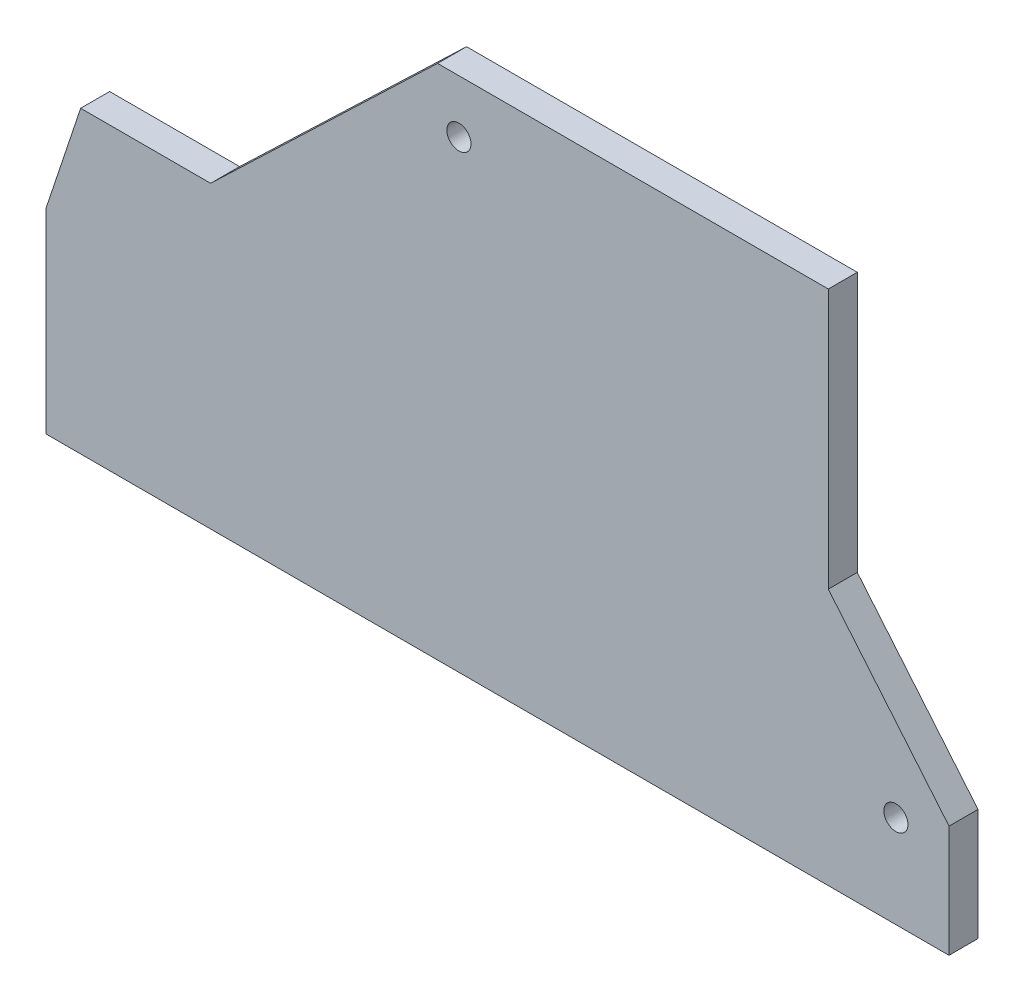
ISO-10303-21;
HEADER;
FILE_DESCRIPTION(('STEP AP214'),'2;1');
FILE_NAME('part.step','',(''),(''),'','','');
FILE_SCHEMA(('AUTOMOTIVE_DESIGN { 1 0 10303 214 1 1 1 1 }'));
ENDSEC;
DATA;
#1=APPLICATION_CONTEXT('core data for automotive mechanical design processes');
#2=APPLICATION_PROTOCOL_DEFINITION('international standard','automotive_design',2000,#1);
#3=PRODUCT_CONTEXT('',#1,'mechanical');
#4=PRODUCT('Part','Part','',(#3));
#5=PRODUCT_RELATED_PRODUCT_CATEGORY('part','',(#4));
#6=PRODUCT_DEFINITION_FORMATION('','',#4);
#7=PRODUCT_DEFINITION_CONTEXT('part definition',#1,'design');
#8=PRODUCT_DEFINITION('design','',#6,#7);
#9=PRODUCT_DEFINITION_SHAPE('','',#8);
#10=(LENGTH_UNIT() NAMED_UNIT(*) SI_UNIT(.MILLI.,.METRE.));
#11=(NAMED_UNIT(*) PLANE_ANGLE_UNIT() SI_UNIT($,.RADIAN.));
#12=(NAMED_UNIT(*) SI_UNIT($,.STERADIAN.) SOLID_ANGLE_UNIT());
#13=UNCERTAINTY_MEASURE_WITH_UNIT(LENGTH_MEASURE(1.E-05),#10,'distance_accuracy_value','');
#14=(GEOMETRIC_REPRESENTATION_CONTEXT(3) GLOBAL_UNCERTAINTY_ASSIGNED_CONTEXT((#13)) GLOBAL_UNIT_ASSIGNED_CONTEXT((#10,
#11,#12)) REPRESENTATION_CONTEXT('',''));
#15=CARTESIAN_POINT('',(0.,0.,0.));
#16=DIRECTION('',(0.,0.,1.));
#17=DIRECTION('',(1.,0.,0.));
#18=AXIS2_PLACEMENT_3D('',#15,#16,#17);
#19=CARTESIAN_POINT('',(1.8437310710337,7.53644255919475,105.));
#20=DIRECTION('',(-0.768221279597376,-0.64018439966448,0.));
#21=DIRECTION('',(0.64018439966448,-0.768221279597376,0.));
#22=AXIS2_PLACEMENT_3D('',#19,#20,#21);
#23=PLANE('',#22);
#24=DIRECTION('',(0.,0.,-1.));
#25=VECTOR('',#24,1.);
#26=CARTESIAN_POINT('',(-7.6,18.8689198444352,105.));
#27=LINE('',#26,#25);
#28=CARTESIAN_POINT('',(-7.6,18.8689198444352,0.));
#29=VERTEX_POINT('',#28);
#30=CARTESIAN_POINT('',(-7.6,18.8689198444352,-2.4));
#31=VERTEX_POINT('',#30);
#32=EDGE_CURVE('E101',#29,#31,#27,.T.);
#33=ORIENTED_EDGE('',*,*,#32,.F.);
#34=DIRECTION('',(0.64018439966448,-0.768221279597376,0.));
#35=VECTOR('',#34,1.);
#36=CARTESIAN_POINT('',(1.8437310710337,7.53644255919475,0.));
#37=LINE('',#36,#35);
#38=CARTESIAN_POINT('',(2.4,6.86891984443519,0.));
#39=VERTEX_POINT('',#38);
#40=EDGE_CURVE('E37',#29,#39,#37,.T.);
#41=ORIENTED_EDGE('',*,*,#40,.T.);
#42=DIRECTION('',(0.,0.,-1.));
#43=VECTOR('',#42,1.);
#44=CARTESIAN_POINT('',(2.4,6.86891984443519,105.));
#45=LINE('',#44,#43);
#46=CARTESIAN_POINT('',(2.4,6.86891984443519,-2.4));
#47=VERTEX_POINT('',#46);
#48=EDGE_CURVE('E109',#39,#47,#45,.T.);
#49=ORIENTED_EDGE('',*,*,#48,.T.);
#50=DIRECTION('',(-0.64018439966448,0.768221279597376,0.));
#51=VECTOR('',#50,1.);
#52=CARTESIAN_POINT('',(1.8437310710337,7.53644255919475,-2.4));
#53=LINE('',#52,#51);
#54=EDGE_CURVE('E113',#47,#31,#53,.T.);
#55=ORIENTED_EDGE('',*,*,#54,.T.);
#56=EDGE_LOOP('',(#33,#41,#49,#55));
#57=FACE_BOUND('',#56,.T.);
#58=ADVANCED_FACE('F33',(#57),#23,.F.);
#59=CARTESIAN_POINT('',(-7.6,18.,105.));
#60=DIRECTION('',(-1.,0.,0.));
#61=DIRECTION('',(0.,0.,1.));
#62=AXIS2_PLACEMENT_3D('',#59,#60,#61);
#63=PLANE('',#62);
#64=DIRECTION('',(0.,0.,-1.));
#65=VECTOR('',#64,1.);
#66=CARTESIAN_POINT('',(-7.6,40.4,105.));
#67=LINE('',#66,#65);
#68=CARTESIAN_POINT('',(-7.6,40.4,0.));
#69=VERTEX_POINT('',#68);
#70=CARTESIAN_POINT('',(-7.6,40.4,-2.4));
#71=VERTEX_POINT('',#70);
#72=EDGE_CURVE('E110',#69,#71,#67,.T.);
#73=ORIENTED_EDGE('',*,*,#72,.F.);
#74=DIRECTION('',(0.,-1.,0.));
#75=VECTOR('',#74,1.);
#76=CARTESIAN_POINT('',(-7.6,18.,0.));
#77=LINE('',#76,#75);
#78=EDGE_CURVE('E108',#69,#29,#77,.T.);
#79=ORIENTED_EDGE('',*,*,#78,.T.);
#80=ORIENTED_EDGE('',*,*,#32,.T.);
#81=DIRECTION('',(0.,1.,0.));
#82=VECTOR('',#81,1.);
#83=CARTESIAN_POINT('',(-7.6,18.,-2.4));
#84=LINE('',#83,#82);
#85=EDGE_CURVE('E106',#31,#71,#84,.T.);
#86=ORIENTED_EDGE('',*,*,#85,.T.);
#87=EDGE_LOOP('',(#73,#79,#80,#86));
#88=FACE_BOUND('',#87,.T.);
#89=ADVANCED_FACE('F104',(#88),#63,.F.);
#90=CARTESIAN_POINT('',(-10.,40.4,105.));
#91=DIRECTION('',(0.,-1.,0.));
#92=DIRECTION('',(1.,0.,0.));
#93=AXIS2_PLACEMENT_3D('',#90,#91,#92);
#94=PLANE('',#93);
#95=DIRECTION('',(0.,0.,-1.));
#96=VECTOR('',#95,1.);
#97=CARTESIAN_POINT('',(-39.9636903434661,40.4,105.));
#98=LINE('',#97,#96);
#99=CARTESIAN_POINT('',(-39.9636903434661,40.4,0.));
#100=VERTEX_POINT('',#99);
#101=CARTESIAN_POINT('',(-39.9636903434661,40.4,-2.4));
#102=VERTEX_POINT('',#101);
#103=EDGE_CURVE('E128',#100,#102,#98,.T.);
#104=ORIENTED_EDGE('',*,*,#103,.F.);
#105=DIRECTION('',(1.,0.,0.));
#106=VECTOR('',#105,1.);
#107=CARTESIAN_POINT('',(-10.,40.4,0.));
#108=LINE('',#107,#106);
#109=EDGE_CURVE('E161',#100,#69,#108,.T.);
#110=ORIENTED_EDGE('',*,*,#109,.T.);
#111=ORIENTED_EDGE('',*,*,#72,.T.);
#112=DIRECTION('',(-1.,0.,0.));
#113=VECTOR('',#112,1.);
#114=CARTESIAN_POINT('',(-10.,40.4,-2.4));
#115=LINE('',#114,#113);
#116=EDGE_CURVE('E123',#71,#102,#115,.T.);
#117=ORIENTED_EDGE('',*,*,#116,.T.);
#118=EDGE_LOOP('',(#104,#110,#111,#117));
#119=FACE_BOUND('',#118,.T.);
#120=ADVANCED_FACE('F179',(#119),#94,.F.);
#121=CARTESIAN_POINT('',(-40.6597715979024,39.7335392244759,105.));
#122=DIRECTION('',(0.691571499126013,-0.722308010198281,0.));
#123=DIRECTION('',(0.722308010198281,0.691571499126013,0.));
#124=AXIS2_PLACEMENT_3D('',#121,#122,#123);
#125=PLANE('',#124);
#126=DIRECTION('',(0.,0.,-1.));
#127=VECTOR('',#126,1.);
#128=CARTESIAN_POINT('',(-58.7636903434661,22.4,105.));
#129=LINE('',#128,#127);
#130=CARTESIAN_POINT('',(-58.7636903434661,22.4,0.));
#131=VERTEX_POINT('',#130);
#132=CARTESIAN_POINT('',(-58.7636903434661,22.4,-2.4));
#133=VERTEX_POINT('',#132);
#134=EDGE_CURVE('E131',#131,#133,#129,.T.);
#135=ORIENTED_EDGE('',*,*,#134,.F.);
#136=DIRECTION('',(0.722308010198281,0.691571499126013,0.));
#137=VECTOR('',#136,1.);
#138=CARTESIAN_POINT('',(-40.6597715979024,39.7335392244759,0.));
#139=LINE('',#138,#137);
#140=EDGE_CURVE('E162',#131,#100,#139,.T.);
#141=ORIENTED_EDGE('',*,*,#140,.T.);
#142=ORIENTED_EDGE('',*,*,#103,.T.);
#143=DIRECTION('',(-0.722308010198281,-0.691571499126013,0.));
#144=VECTOR('',#143,1.);
#145=CARTESIAN_POINT('',(-40.6597715979024,39.7335392244759,-2.4));
#146=LINE('',#145,#144);
#147=EDGE_CURVE('E125',#102,#133,#146,.T.);
#148=ORIENTED_EDGE('',*,*,#147,.T.);
#149=EDGE_LOOP('',(#135,#141,#142,#148));
#150=FACE_BOUND('',#149,.T.);
#151=ADVANCED_FACE('F175',(#150),#125,.F.);
#152=CARTESIAN_POINT('',(-57.8,22.4,105.));
#153=DIRECTION('',(0.,-1.,0.));
#154=DIRECTION('',(0.,0.,-1.));
#155=AXIS2_PLACEMENT_3D('',#152,#153,#154);
#156=PLANE('',#155);
#157=DIRECTION('',(0.,0.,-1.));
#158=VECTOR('',#157,1.);
#159=CARTESIAN_POINT('',(-69.5298204994654,22.4,105.));
#160=LINE('',#159,#158);
#161=CARTESIAN_POINT('',(-69.5298204994654,22.4,0.));
#162=VERTEX_POINT('',#161);
#163=CARTESIAN_POINT('',(-69.5298204994654,22.4,-2.4));
#164=VERTEX_POINT('',#163);
#165=EDGE_CURVE('E136',#162,#164,#160,.T.);
#166=ORIENTED_EDGE('',*,*,#165,.F.);
#167=DIRECTION('',(1.,0.,0.));
#168=VECTOR('',#167,1.);
#169=CARTESIAN_POINT('',(-57.8,22.4,0.));
#170=LINE('',#169,#168);
#171=EDGE_CURVE('E169',#162,#131,#170,.T.);
#172=ORIENTED_EDGE('',*,*,#171,.T.);
#173=ORIENTED_EDGE('',*,*,#134,.T.);
#174=DIRECTION('',(-1.,0.,0.));
#175=VECTOR('',#174,1.);
#176=CARTESIAN_POINT('',(-57.8,22.4,-2.4));
#177=LINE('',#176,#175);
#178=EDGE_CURVE('E134',#133,#164,#177,.T.);
#179=ORIENTED_EDGE('',*,*,#178,.T.);
#180=EDGE_LOOP('',(#166,#172,#173,#179));
#181=FACE_BOUND('',#180,.T.);
#182=ADVANCED_FACE('F185',(#181),#156,.F.);
#183=CARTESIAN_POINT('',(-70.0768392374227,20.7589486721329,105.));
#184=DIRECTION('',(0.948683015592804,-0.316228613388706,0.));
#185=DIRECTION('',(0.316228613388706,0.948683015592804,0.));
#186=AXIS2_PLACEMENT_3D('',#183,#184,#185);
#187=PLANE('',#186);
#188=DIRECTION('',(0.,0.,-1.));
#189=VECTOR('',#188,1.);
#190=CARTESIAN_POINT('',(-72.4,13.7894871350151,105.));
#191=LINE('',#190,#189);
#192=CARTESIAN_POINT('',(-72.4,13.7894871350151,0.));
#193=VERTEX_POINT('',#192);
#194=CARTESIAN_POINT('',(-72.4,13.7894871350151,-2.4));
#195=VERTEX_POINT('',#194);
#196=EDGE_CURVE('E141',#193,#195,#191,.T.);
#197=ORIENTED_EDGE('',*,*,#196,.F.);
#198=DIRECTION('',(0.316228613388706,0.948683015592804,0.));
#199=VECTOR('',#198,1.);
#200=CARTESIAN_POINT('',(-70.0768392374227,20.7589486721329,0.));
#201=LINE('',#200,#199);
#202=EDGE_CURVE('E167',#193,#162,#201,.T.);
#203=ORIENTED_EDGE('',*,*,#202,.T.);
#204=ORIENTED_EDGE('',*,*,#165,.T.);
#205=DIRECTION('',(-0.316228613388706,-0.948683015592804,0.));
#206=VECTOR('',#205,1.);
#207=CARTESIAN_POINT('',(-70.0768392374227,20.7589486721329,-2.4));
#208=LINE('',#207,#206);
#209=EDGE_CURVE('E139',#164,#195,#208,.T.);
#210=ORIENTED_EDGE('',*,*,#209,.T.);
#211=EDGE_LOOP('',(#197,#203,#204,#210));
#212=FACE_BOUND('',#211,.T.);
#213=ADVANCED_FACE('F192',(#212),#187,.F.);
#214=CARTESIAN_POINT('',(0.,0.,-2.4));
#215=DIRECTION('',(0.,0.,1.));
#216=DIRECTION('',(1.,0.,0.));
#217=AXIS2_PLACEMENT_3D('',#214,#215,#216);
#218=PLANE('',#217);
#219=CARTESIAN_POINT('',(-2.,5.27590012963734,-2.4));
#220=DIRECTION('',(0.,0.,-1.));
#221=DIRECTION('',(-1.,0.,0.));
#222=AXIS2_PLACEMENT_3D('',#219,#220,#221);
#223=CIRCLE('',#222,1.);
#224=CARTESIAN_POINT('',(-3.,5.27590012963734,-2.4));
#225=VERTEX_POINT('',#224);
#226=EDGE_CURVE('E205',#225,#225,#223,.T.);
#227=ORIENTED_EDGE('',*,*,#226,.F.);
#228=EDGE_LOOP('',(#227));
#229=FACE_BOUND('',#228,.T.);
#230=CARTESIAN_POINT('',(-38.1969247137782,36.,-2.4));
#231=DIRECTION('',(0.,0.,-1.));
#232=DIRECTION('',(-1.,0.,0.));
#233=AXIS2_PLACEMENT_3D('',#230,#231,#232);
#234=CIRCLE('',#233,0.999999999999998);
#235=CARTESIAN_POINT('',(-39.1969247137782,36.,-2.4));
#236=VERTEX_POINT('',#235);
#237=EDGE_CURVE('E206',#236,#236,#234,.T.);
#238=ORIENTED_EDGE('',*,*,#237,.F.);
#239=EDGE_LOOP('',(#238));
#240=FACE_BOUND('',#239,.T.);
#241=DIRECTION('',(0.,1.,0.));
#242=VECTOR('',#241,1.);
#243=CARTESIAN_POINT('',(2.4,0.,-2.4));
#244=LINE('',#243,#242);
#245=CARTESIAN_POINT('',(2.4,-2.4,-2.4));
#246=VERTEX_POINT('',#245);
#247=EDGE_CURVE('E118',#246,#47,#244,.T.);
#248=ORIENTED_EDGE('',*,*,#247,.F.);
#249=DIRECTION('',(1.,0.,0.));
#250=VECTOR('',#249,1.);
#251=CARTESIAN_POINT('',(0.,-2.4,-2.4));
#252=LINE('',#251,#250);
#253=CARTESIAN_POINT('',(-72.4,-2.4,-2.4));
#254=VERTEX_POINT('',#253);
#255=EDGE_CURVE('E149',#254,#246,#252,.T.);
#256=ORIENTED_EDGE('',*,*,#255,.F.);
#257=DIRECTION('',(0.,-1.,0.));
#258=VECTOR('',#257,1.);
#259=CARTESIAN_POINT('',(-72.4,0.,-2.4));
#260=LINE('',#259,#258);
#261=EDGE_CURVE('E144',#195,#254,#260,.T.);
#262=ORIENTED_EDGE('',*,*,#261,.F.);
#263=ORIENTED_EDGE('',*,*,#209,.F.);
#264=ORIENTED_EDGE('',*,*,#178,.F.);
#265=ORIENTED_EDGE('',*,*,#147,.F.);
#266=ORIENTED_EDGE('',*,*,#116,.F.);
#267=ORIENTED_EDGE('',*,*,#85,.F.);
#268=ORIENTED_EDGE('',*,*,#54,.F.);
#269=EDGE_LOOP('',(#248,#256,#262,#263,#264,#265,#266,#267,#268));
#270=FACE_BOUND('',#269,.T.);
#271=ADVANCED_FACE('F120',(#229,#240,#270),#218,.F.);
#272=CARTESIAN_POINT('',(-2.,5.27590012963734,6.));
#273=DIRECTION('',(0.,0.,-1.));
#274=DIRECTION('',(-1.,0.,0.));
#275=AXIS2_PLACEMENT_3D('',#272,#273,#274);
#276=CYLINDRICAL_SURFACE('',#275,1.);
#277=CARTESIAN_POINT('',(-2.,5.27590012963734,0.));
#278=DIRECTION('',(0.,0.,-1.));
#279=DIRECTION('',(-1.,0.,0.));
#280=AXIS2_PLACEMENT_3D('',#277,#278,#279);
#281=CIRCLE('',#280,1.);
#282=CARTESIAN_POINT('',(-3.,5.27590012963734,0.));
#283=VERTEX_POINT('',#282);
#284=EDGE_CURVE('E154',#283,#283,#281,.F.);
#285=ORIENTED_EDGE('',*,*,#284,.T.);
#286=EDGE_LOOP('',(#285));
#287=FACE_BOUND('',#286,.T.);
#288=ORIENTED_EDGE('',*,*,#226,.T.);
#289=EDGE_LOOP('',(#288));
#290=FACE_BOUND('',#289,.T.);
#291=ADVANCED_FACE('F212',(#287,#290),#276,.F.);
#292=CARTESIAN_POINT('',(-38.1969247137782,36.,6.));
#293=DIRECTION('',(0.,0.,-1.));
#294=DIRECTION('',(-1.,0.,0.));
#295=AXIS2_PLACEMENT_3D('',#292,#293,#294);
#296=CYLINDRICAL_SURFACE('',#295,0.999999999999998);
#297=CARTESIAN_POINT('',(-38.1969247137782,36.,0.));
#298=DIRECTION('',(0.,0.,-1.));
#299=DIRECTION('',(-1.,0.,0.));
#300=AXIS2_PLACEMENT_3D('',#297,#298,#299);
#301=CIRCLE('',#300,0.999999999999998);
#302=CARTESIAN_POINT('',(-39.1969247137782,36.,0.));
#303=VERTEX_POINT('',#302);
#304=EDGE_CURVE('E157',#303,#303,#301,.F.);
#305=ORIENTED_EDGE('',*,*,#304,.T.);
#306=EDGE_LOOP('',(#305));
#307=FACE_BOUND('',#306,.T.);
#308=ORIENTED_EDGE('',*,*,#237,.T.);
#309=EDGE_LOOP('',(#308));
#310=FACE_BOUND('',#309,.T.);
#311=ADVANCED_FACE('F218',(#307,#310),#296,.F.);
#312=CARTESIAN_POINT('',(-72.4,0.,105.));
#313=DIRECTION('',(1.,0.,0.));
#314=DIRECTION('',(0.,0.,-1.));
#315=AXIS2_PLACEMENT_3D('',#312,#313,#314);
#316=PLANE('',#315);
#317=DIRECTION('',(0.,0.,-1.));
#318=VECTOR('',#317,1.);
#319=CARTESIAN_POINT('',(-72.4,-2.4,105.));
#320=LINE('',#319,#318);
#321=CARTESIAN_POINT('',(-72.4,-2.4,0.));
#322=VERTEX_POINT('',#321);
#323=EDGE_CURVE('E146',#322,#254,#320,.T.);
#324=ORIENTED_EDGE('',*,*,#323,.F.);
#325=DIRECTION('',(0.,1.,0.));
#326=VECTOR('',#325,1.);
#327=CARTESIAN_POINT('',(-72.4,0.,0.));
#328=LINE('',#327,#326);
#329=EDGE_CURVE('E160',#322,#193,#328,.T.);
#330=ORIENTED_EDGE('',*,*,#329,.T.);
#331=ORIENTED_EDGE('',*,*,#196,.T.);
#332=ORIENTED_EDGE('',*,*,#261,.T.);
#333=EDGE_LOOP('',(#324,#330,#331,#332));
#334=FACE_BOUND('',#333,.T.);
#335=ADVANCED_FACE('F194',(#334),#316,.F.);
#336=CARTESIAN_POINT('',(2.4,0.,105.));
#337=DIRECTION('',(-1.,0.,0.));
#338=DIRECTION('',(0.,0.,1.));
#339=AXIS2_PLACEMENT_3D('',#336,#337,#338);
#340=PLANE('',#339);
#341=ORIENTED_EDGE('',*,*,#48,.F.);
#342=DIRECTION('',(0.,-1.,0.));
#343=VECTOR('',#342,1.);
#344=CARTESIAN_POINT('',(2.4,0.,0.));
#345=LINE('',#344,#343);
#346=CARTESIAN_POINT('',(2.4,-2.4,0.));
#347=VERTEX_POINT('',#346);
#348=EDGE_CURVE('E11',#39,#347,#345,.T.);
#349=ORIENTED_EDGE('',*,*,#348,.T.);
#350=DIRECTION('',(0.,0.,-1.));
#351=VECTOR('',#350,1.);
#352=CARTESIAN_POINT('',(2.4,-2.4,105.));
#353=LINE('',#352,#351);
#354=EDGE_CURVE('E151',#347,#246,#353,.T.);
#355=ORIENTED_EDGE('',*,*,#354,.T.);
#356=ORIENTED_EDGE('',*,*,#247,.T.);
#357=EDGE_LOOP('',(#341,#349,#355,#356));
#358=FACE_BOUND('',#357,.T.);
#359=ADVANCED_FACE('F200',(#358),#340,.F.);
#360=CARTESIAN_POINT('',(0.,-2.4,105.));
#361=DIRECTION('',(0.,1.,0.));
#362=DIRECTION('',(0.,0.,1.));
#363=AXIS2_PLACEMENT_3D('',#360,#361,#362);
#364=PLANE('',#363);
#365=ORIENTED_EDGE('',*,*,#354,.F.);
#366=DIRECTION('',(-1.,0.,0.));
#367=VECTOR('',#366,1.);
#368=CARTESIAN_POINT('',(0.,-2.4,0.));
#369=LINE('',#368,#367);
#370=EDGE_CURVE('E158',#347,#322,#369,.T.);
#371=ORIENTED_EDGE('',*,*,#370,.T.);
#372=ORIENTED_EDGE('',*,*,#323,.T.);
#373=ORIENTED_EDGE('',*,*,#255,.T.);
#374=EDGE_LOOP('',(#365,#371,#372,#373));
#375=FACE_BOUND('',#374,.T.);
#376=ADVANCED_FACE('F198',(#375),#364,.F.);
#377=CARTESIAN_POINT('',(0.,0.,0.));
#378=DIRECTION('',(0.,0.,1.));
#379=DIRECTION('',(1.,0.,0.));
#380=AXIS2_PLACEMENT_3D('',#377,#378,#379);
#381=PLANE('',#380);
#382=ORIENTED_EDGE('',*,*,#284,.F.);
#383=EDGE_LOOP('',(#382));
#384=FACE_BOUND('',#383,.T.);
#385=ORIENTED_EDGE('',*,*,#304,.F.);
#386=EDGE_LOOP('',(#385));
#387=FACE_BOUND('',#386,.T.);
#388=ORIENTED_EDGE('',*,*,#78,.F.);
#389=ORIENTED_EDGE('',*,*,#109,.F.);
#390=ORIENTED_EDGE('',*,*,#140,.F.);
#391=ORIENTED_EDGE('',*,*,#171,.F.);
#392=ORIENTED_EDGE('',*,*,#202,.F.);
#393=ORIENTED_EDGE('',*,*,#329,.F.);
#394=ORIENTED_EDGE('',*,*,#370,.F.);
#395=ORIENTED_EDGE('',*,*,#348,.F.);
#396=ORIENTED_EDGE('',*,*,#40,.F.);
#397=EDGE_LOOP('',(#388,#389,#390,#391,#392,#393,#394,#395,#396));
#398=FACE_BOUND('',#397,.T.);
#399=ADVANCED_FACE('F35',(#384,#387,#398),#381,.T.);
#400=CLOSED_SHELL('',(#58,#89,#120,#151,#182,#213,#271,#291,#311,#335,#359,#376,#399));
#401=MANIFOLD_SOLID_BREP('B2',#400);
#402=ADVANCED_BREP_SHAPE_REPRESENTATION('',(#18,#401),#14);
#403=SHAPE_DEFINITION_REPRESENTATION(#9,#402);
ENDSEC;
END-ISO-10303-21;
